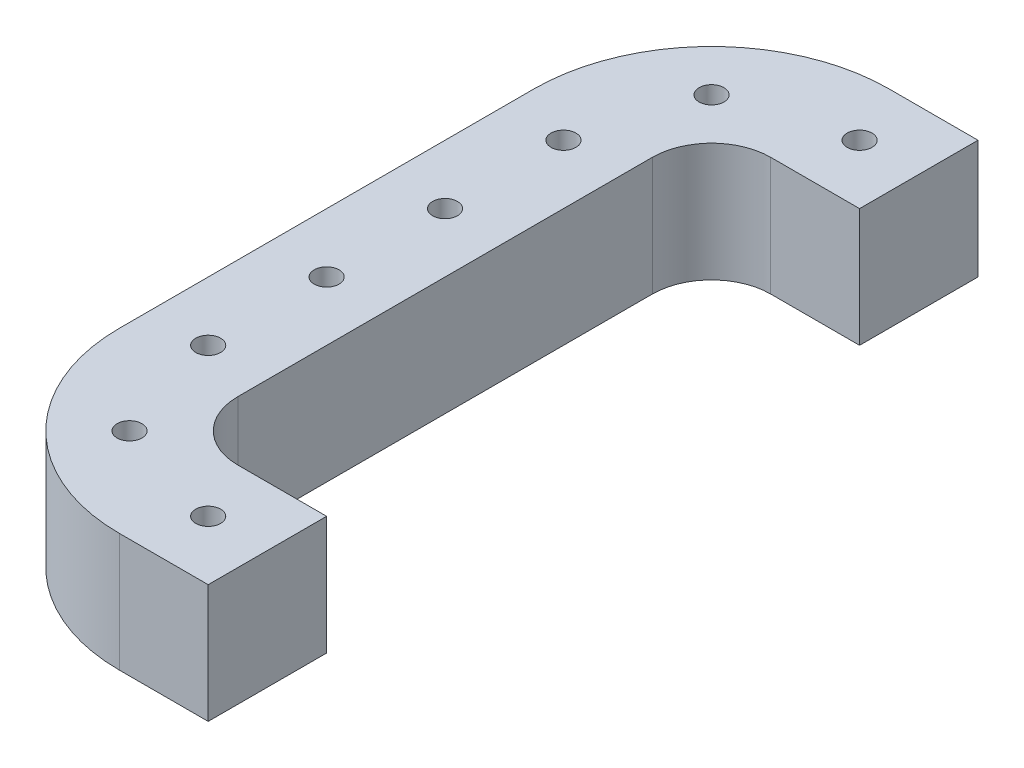
ISO-10303-21;
HEADER;
FILE_DESCRIPTION(('STEP AP214'),'2;1');
FILE_NAME('part.step','',(''),(''),'','','');
FILE_SCHEMA(('AUTOMOTIVE_DESIGN { 1 0 10303 214 1 1 1 1 }'));
ENDSEC;
DATA;
#1=APPLICATION_CONTEXT('core data for automotive mechanical design processes');
#2=APPLICATION_PROTOCOL_DEFINITION('international standard','automotive_design',2000,#1);
#3=PRODUCT_CONTEXT('',#1,'mechanical');
#4=PRODUCT('Part','Part','',(#3));
#5=PRODUCT_RELATED_PRODUCT_CATEGORY('part','',(#4));
#6=PRODUCT_DEFINITION_FORMATION('','',#4);
#7=PRODUCT_DEFINITION_CONTEXT('part definition',#1,'design');
#8=PRODUCT_DEFINITION('design','',#6,#7);
#9=PRODUCT_DEFINITION_SHAPE('','',#8);
#10=(LENGTH_UNIT() NAMED_UNIT(*) SI_UNIT(.MILLI.,.METRE.));
#11=(NAMED_UNIT(*) PLANE_ANGLE_UNIT() SI_UNIT($,.RADIAN.));
#12=(NAMED_UNIT(*) SI_UNIT($,.STERADIAN.) SOLID_ANGLE_UNIT());
#13=UNCERTAINTY_MEASURE_WITH_UNIT(LENGTH_MEASURE(1.E-05),#10,'distance_accuracy_value','');
#14=(GEOMETRIC_REPRESENTATION_CONTEXT(3) GLOBAL_UNCERTAINTY_ASSIGNED_CONTEXT((#13)) GLOBAL_UNIT_ASSIGNED_CONTEXT((#10,
#11,#12)) REPRESENTATION_CONTEXT('',''));
#15=CARTESIAN_POINT('',(0.,0.,0.));
#16=DIRECTION('',(0.,0.,1.));
#17=DIRECTION('',(1.,0.,0.));
#18=AXIS2_PLACEMENT_3D('',#15,#16,#17);
#19=CARTESIAN_POINT('',(10.,10.,0.));
#20=DIRECTION('',(-1.,0.,0.));
#21=DIRECTION('',(0.,0.,1.));
#22=AXIS2_PLACEMENT_3D('',#19,#20,#21);
#23=PLANE('',#22);
#24=DIRECTION('',(0.,0.,-1.));
#25=VECTOR('',#24,1.);
#26=CARTESIAN_POINT('',(10.,-10.,0.));
#27=LINE('',#26,#25);
#28=CARTESIAN_POINT('',(10.,-10.,55.));
#29=VERTEX_POINT('',#28);
#30=CARTESIAN_POINT('',(10.,-10.,-15.));
#31=VERTEX_POINT('',#30);
#32=EDGE_CURVE('E125',#29,#31,#27,.T.);
#33=ORIENTED_EDGE('',*,*,#32,.T.);
#34=DIRECTION('',(0.,-1.,0.));
#35=VECTOR('',#34,1.);
#36=CARTESIAN_POINT('',(10.,10.,-15.));
#37=LINE('',#36,#35);
#38=CARTESIAN_POINT('',(10.,10.,-15.));
#39=VERTEX_POINT('',#38);
#40=EDGE_CURVE('E11',#39,#31,#37,.T.);
#41=ORIENTED_EDGE('',*,*,#40,.F.);
#42=DIRECTION('',(0.,0.,-1.));
#43=VECTOR('',#42,1.);
#44=CARTESIAN_POINT('',(10.,10.,0.));
#45=LINE('',#44,#43);
#46=CARTESIAN_POINT('',(10.,10.,55.));
#47=VERTEX_POINT('',#46);
#48=EDGE_CURVE('E87',#47,#39,#45,.T.);
#49=ORIENTED_EDGE('',*,*,#48,.F.);
#50=DIRECTION('',(0.,-1.,0.));
#51=VECTOR('',#50,1.);
#52=CARTESIAN_POINT('',(10.,10.,55.));
#53=LINE('',#52,#51);
#54=EDGE_CURVE('E189',#47,#29,#53,.T.);
#55=ORIENTED_EDGE('',*,*,#54,.T.);
#56=EDGE_LOOP('',(#33,#41,#49,#55));
#57=FACE_BOUND('',#56,.T.);
#58=ADVANCED_FACE('F33',(#57),#23,.F.);
#59=CARTESIAN_POINT('',(20.,10.,-15.));
#60=DIRECTION('',(0.,-1.,0.));
#61=DIRECTION('',(0.,0.,-1.));
#62=AXIS2_PLACEMENT_3D('',#59,#60,#61);
#63=CYLINDRICAL_SURFACE('',#62,10.);
#64=CARTESIAN_POINT('',(20.,-10.,-15.));
#65=DIRECTION('',(0.,-1.,0.));
#66=DIRECTION('',(0.,0.,-1.));
#67=AXIS2_PLACEMENT_3D('',#64,#65,#66);
#68=CIRCLE('',#67,10.);
#69=CARTESIAN_POINT('',(20.,-10.,-25.));
#70=VERTEX_POINT('',#69);
#71=EDGE_CURVE('E127',#31,#70,#68,.T.);
#72=ORIENTED_EDGE('',*,*,#71,.T.);
#73=DIRECTION('',(0.,-1.,0.));
#74=VECTOR('',#73,1.);
#75=CARTESIAN_POINT('',(20.,10.,-25.));
#76=LINE('',#75,#74);
#77=CARTESIAN_POINT('',(20.,10.,-25.));
#78=VERTEX_POINT('',#77);
#79=EDGE_CURVE('E41',#78,#70,#76,.T.);
#80=ORIENTED_EDGE('',*,*,#79,.F.);
#81=CARTESIAN_POINT('',(20.,10.,-15.));
#82=DIRECTION('',(0.,-1.,0.));
#83=DIRECTION('',(0.,0.,-1.));
#84=AXIS2_PLACEMENT_3D('',#81,#82,#83);
#85=CIRCLE('',#84,10.);
#86=EDGE_CURVE('E216',#39,#78,#85,.T.);
#87=ORIENTED_EDGE('',*,*,#86,.F.);
#88=ORIENTED_EDGE('',*,*,#40,.T.);
#89=EDGE_LOOP('',(#72,#80,#87,#88));
#90=FACE_BOUND('',#89,.T.);
#91=ADVANCED_FACE('F217',(#90),#63,.F.);
#92=CARTESIAN_POINT('',(20.,10.,-25.));
#93=DIRECTION('',(0.,0.,-1.));
#94=DIRECTION('',(-1.,0.,0.));
#95=AXIS2_PLACEMENT_3D('',#92,#93,#94);
#96=PLANE('',#95);
#97=DIRECTION('',(1.,0.,0.));
#98=VECTOR('',#97,1.);
#99=CARTESIAN_POINT('',(20.,-10.,-25.));
#100=LINE('',#99,#98);
#101=CARTESIAN_POINT('',(35.,-10.,-25.));
#102=VERTEX_POINT('',#101);
#103=EDGE_CURVE('E130',#70,#102,#100,.T.);
#104=ORIENTED_EDGE('',*,*,#103,.T.);
#105=DIRECTION('',(0.,-1.,0.));
#106=VECTOR('',#105,1.);
#107=CARTESIAN_POINT('',(35.,10.,-25.));
#108=LINE('',#107,#106);
#109=CARTESIAN_POINT('',(35.,10.,-25.));
#110=VERTEX_POINT('',#109);
#111=EDGE_CURVE('E114',#110,#102,#108,.T.);
#112=ORIENTED_EDGE('',*,*,#111,.F.);
#113=DIRECTION('',(1.,0.,0.));
#114=VECTOR('',#113,1.);
#115=CARTESIAN_POINT('',(20.,10.,-25.));
#116=LINE('',#115,#114);
#117=EDGE_CURVE('E105',#78,#110,#116,.T.);
#118=ORIENTED_EDGE('',*,*,#117,.F.);
#119=ORIENTED_EDGE('',*,*,#79,.T.);
#120=EDGE_LOOP('',(#104,#112,#118,#119));
#121=FACE_BOUND('',#120,.T.);
#122=ADVANCED_FACE('F144',(#121),#96,.F.);
#123=CARTESIAN_POINT('',(35.,10.,-25.));
#124=DIRECTION('',(-1.,0.,0.));
#125=DIRECTION('',(0.,0.,1.));
#126=AXIS2_PLACEMENT_3D('',#123,#124,#125);
#127=PLANE('',#126);
#128=DIRECTION('',(0.,0.,-1.));
#129=VECTOR('',#128,1.);
#130=CARTESIAN_POINT('',(35.,-10.,-25.));
#131=LINE('',#130,#129);
#132=CARTESIAN_POINT('',(35.,-10.,-45.));
#133=VERTEX_POINT('',#132);
#134=EDGE_CURVE('E113',#102,#133,#131,.T.);
#135=ORIENTED_EDGE('',*,*,#134,.T.);
#136=DIRECTION('',(0.,-1.,0.));
#137=VECTOR('',#136,1.);
#138=CARTESIAN_POINT('',(35.,10.,-45.));
#139=LINE('',#138,#137);
#140=CARTESIAN_POINT('',(35.,10.,-45.));
#141=VERTEX_POINT('',#140);
#142=EDGE_CURVE('E110',#141,#133,#139,.T.);
#143=ORIENTED_EDGE('',*,*,#142,.F.);
#144=DIRECTION('',(0.,0.,-1.));
#145=VECTOR('',#144,1.);
#146=CARTESIAN_POINT('',(35.,10.,-25.));
#147=LINE('',#146,#145);
#148=EDGE_CURVE('E98',#110,#141,#147,.T.);
#149=ORIENTED_EDGE('',*,*,#148,.F.);
#150=ORIENTED_EDGE('',*,*,#111,.T.);
#151=EDGE_LOOP('',(#135,#143,#149,#150));
#152=FACE_BOUND('',#151,.T.);
#153=ADVANCED_FACE('F111',(#152),#127,.F.);
#154=CARTESIAN_POINT('',(20.,10.,-45.));
#155=DIRECTION('',(0.,0.,1.));
#156=DIRECTION('',(1.,0.,0.));
#157=AXIS2_PLACEMENT_3D('',#154,#155,#156);
#158=PLANE('',#157);
#159=DIRECTION('',(-1.,0.,0.));
#160=VECTOR('',#159,1.);
#161=CARTESIAN_POINT('',(20.,-10.,-45.));
#162=LINE('',#161,#160);
#163=CARTESIAN_POINT('',(20.,-10.,-45.));
#164=VERTEX_POINT('',#163);
#165=EDGE_CURVE('E73',#133,#164,#162,.T.);
#166=ORIENTED_EDGE('',*,*,#165,.T.);
#167=DIRECTION('',(0.,-1.,0.));
#168=VECTOR('',#167,1.);
#169=CARTESIAN_POINT('',(20.,10.,-45.));
#170=LINE('',#169,#168);
#171=CARTESIAN_POINT('',(20.,10.,-45.));
#172=VERTEX_POINT('',#171);
#173=EDGE_CURVE('E115',#172,#164,#170,.T.);
#174=ORIENTED_EDGE('',*,*,#173,.F.);
#175=DIRECTION('',(-1.,0.,0.));
#176=VECTOR('',#175,1.);
#177=CARTESIAN_POINT('',(20.,10.,-45.));
#178=LINE('',#177,#176);
#179=EDGE_CURVE('E103',#141,#172,#178,.T.);
#180=ORIENTED_EDGE('',*,*,#179,.F.);
#181=ORIENTED_EDGE('',*,*,#142,.T.);
#182=EDGE_LOOP('',(#166,#174,#180,#181));
#183=FACE_BOUND('',#182,.T.);
#184=ADVANCED_FACE('F117',(#183),#158,.F.);
#185=CARTESIAN_POINT('',(20.,10.,-15.));
#186=DIRECTION('',(0.,-1.,0.));
#187=DIRECTION('',(0.,0.,-1.));
#188=AXIS2_PLACEMENT_3D('',#185,#186,#187);
#189=CYLINDRICAL_SURFACE('',#188,30.);
#190=CARTESIAN_POINT('',(20.,-10.,-15.));
#191=DIRECTION('',(0.,1.,0.));
#192=DIRECTION('',(0.,0.,-1.));
#193=AXIS2_PLACEMENT_3D('',#190,#191,#192);
#194=CIRCLE('',#193,30.);
#195=CARTESIAN_POINT('',(-10.,-10.,-15.));
#196=VERTEX_POINT('',#195);
#197=EDGE_CURVE('E79',#164,#196,#194,.T.);
#198=ORIENTED_EDGE('',*,*,#197,.T.);
#199=DIRECTION('',(0.,-1.,0.));
#200=VECTOR('',#199,1.);
#201=CARTESIAN_POINT('',(-10.,10.,-15.));
#202=LINE('',#201,#200);
#203=CARTESIAN_POINT('',(-10.,10.,-15.));
#204=VERTEX_POINT('',#203);
#205=EDGE_CURVE('E124',#204,#196,#202,.T.);
#206=ORIENTED_EDGE('',*,*,#205,.F.);
#207=CARTESIAN_POINT('',(20.,10.,-15.));
#208=DIRECTION('',(0.,1.,0.));
#209=DIRECTION('',(0.,0.,-1.));
#210=AXIS2_PLACEMENT_3D('',#207,#208,#209);
#211=CIRCLE('',#210,30.);
#212=EDGE_CURVE('E49',#172,#204,#211,.T.);
#213=ORIENTED_EDGE('',*,*,#212,.F.);
#214=ORIENTED_EDGE('',*,*,#173,.T.);
#215=EDGE_LOOP('',(#198,#206,#213,#214));
#216=FACE_BOUND('',#215,.T.);
#217=ADVANCED_FACE('F304',(#216),#189,.T.);
#218=CARTESIAN_POINT('',(-10.,10.,0.));
#219=DIRECTION('',(1.,0.,0.));
#220=DIRECTION('',(0.,0.,-1.));
#221=AXIS2_PLACEMENT_3D('',#218,#219,#220);
#222=PLANE('',#221);
#223=DIRECTION('',(0.,0.,1.));
#224=VECTOR('',#223,1.);
#225=CARTESIAN_POINT('',(-10.,-10.,0.));
#226=LINE('',#225,#224);
#227=CARTESIAN_POINT('',(-10.,-10.,55.));
#228=VERTEX_POINT('',#227);
#229=EDGE_CURVE('E135',#196,#228,#226,.T.);
#230=ORIENTED_EDGE('',*,*,#229,.T.);
#231=DIRECTION('',(0.,-1.,0.));
#232=VECTOR('',#231,1.);
#233=CARTESIAN_POINT('',(-10.,10.,55.));
#234=LINE('',#233,#232);
#235=CARTESIAN_POINT('',(-10.,10.,55.));
#236=VERTEX_POINT('',#235);
#237=EDGE_CURVE('E162',#236,#228,#234,.T.);
#238=ORIENTED_EDGE('',*,*,#237,.F.);
#239=DIRECTION('',(0.,0.,1.));
#240=VECTOR('',#239,1.);
#241=CARTESIAN_POINT('',(-10.,10.,0.));
#242=LINE('',#241,#240);
#243=EDGE_CURVE('E119',#204,#236,#242,.T.);
#244=ORIENTED_EDGE('',*,*,#243,.F.);
#245=ORIENTED_EDGE('',*,*,#205,.T.);
#246=EDGE_LOOP('',(#230,#238,#244,#245));
#247=FACE_BOUND('',#246,.T.);
#248=ADVANCED_FACE('F160',(#247),#222,.F.);
#249=CARTESIAN_POINT('',(20.,10.,-15.));
#250=DIRECTION('',(0.,-1.,0.));
#251=DIRECTION('',(0.,0.,-1.));
#252=AXIS2_PLACEMENT_3D('',#249,#250,#251);
#253=PLANE('',#252);
#254=CARTESIAN_POINT('',(0.,10.,10.));
#255=DIRECTION('',(0.,1.,0.));
#256=DIRECTION('',(0.,0.,1.));
#257=AXIS2_PLACEMENT_3D('',#254,#255,#256);
#258=CIRCLE('',#257,2.1);
#259=CARTESIAN_POINT('',(0.,10.,12.1));
#260=VERTEX_POINT('',#259);
#261=EDGE_CURVE('E192',#260,#260,#258,.T.);
#262=ORIENTED_EDGE('',*,*,#261,.F.);
#263=EDGE_LOOP('',(#262));
#264=FACE_BOUND('',#263,.T.);
#265=CARTESIAN_POINT('',(25.,10.,-35.));
#266=DIRECTION('',(0.,1.,0.));
#267=DIRECTION('',(0.,0.,-1.));
#268=AXIS2_PLACEMENT_3D('',#265,#266,#267);
#269=CIRCLE('',#268,2.1);
#270=CARTESIAN_POINT('',(25.,10.,-37.1));
#271=VERTEX_POINT('',#270);
#272=EDGE_CURVE('E203',#271,#271,#269,.T.);
#273=ORIENTED_EDGE('',*,*,#272,.F.);
#274=EDGE_LOOP('',(#273));
#275=FACE_BOUND('',#274,.T.);
#276=CARTESIAN_POINT('',(0.,10.,-10.));
#277=DIRECTION('',(0.,1.,0.));
#278=DIRECTION('',(0.,0.,1.));
#279=AXIS2_PLACEMENT_3D('',#276,#277,#278);
#280=CIRCLE('',#279,2.1);
#281=CARTESIAN_POINT('',(0.,10.,-7.9));
#282=VERTEX_POINT('',#281);
#283=EDGE_CURVE('E197',#282,#282,#280,.T.);
#284=ORIENTED_EDGE('',*,*,#283,.F.);
#285=EDGE_LOOP('',(#284));
#286=FACE_BOUND('',#285,.T.);
#287=CARTESIAN_POINT('',(5.85786437626905,10.,-29.142135623731));
#288=DIRECTION('',(0.,1.,0.));
#289=DIRECTION('',(0.,0.,1.));
#290=AXIS2_PLACEMENT_3D('',#287,#288,#289);
#291=CIRCLE('',#290,2.1);
#292=CARTESIAN_POINT('',(5.85786437626905,10.,-27.042135623731));
#293=VERTEX_POINT('',#292);
#294=EDGE_CURVE('E196',#293,#293,#291,.T.);
#295=ORIENTED_EDGE('',*,*,#294,.F.);
#296=EDGE_LOOP('',(#295));
#297=FACE_BOUND('',#296,.T.);
#298=ORIENTED_EDGE('',*,*,#243,.T.);
#299=CARTESIAN_POINT('',(20.,10.,55.));
#300=DIRECTION('',(0.,-1.,0.));
#301=DIRECTION('',(0.,0.,1.));
#302=AXIS2_PLACEMENT_3D('',#299,#300,#301);
#303=CIRCLE('',#302,30.);
#304=CARTESIAN_POINT('',(20.,10.,85.));
#305=VERTEX_POINT('',#304);
#306=EDGE_CURVE('E171',#305,#236,#303,.T.);
#307=ORIENTED_EDGE('',*,*,#306,.F.);
#308=DIRECTION('',(-1.,0.,0.));
#309=VECTOR('',#308,1.);
#310=CARTESIAN_POINT('',(20.,10.,85.));
#311=LINE('',#310,#309);
#312=CARTESIAN_POINT('',(35.,10.,85.));
#313=VERTEX_POINT('',#312);
#314=EDGE_CURVE('E176',#313,#305,#311,.T.);
#315=ORIENTED_EDGE('',*,*,#314,.F.);
#316=DIRECTION('',(0.,0.,1.));
#317=VECTOR('',#316,1.);
#318=CARTESIAN_POINT('',(35.,10.,65.));
#319=LINE('',#318,#317);
#320=CARTESIAN_POINT('',(35.,10.,65.));
#321=VERTEX_POINT('',#320);
#322=EDGE_CURVE('E249',#321,#313,#319,.T.);
#323=ORIENTED_EDGE('',*,*,#322,.F.);
#324=DIRECTION('',(1.,0.,0.));
#325=VECTOR('',#324,1.);
#326=CARTESIAN_POINT('',(20.,10.,65.));
#327=LINE('',#326,#325);
#328=CARTESIAN_POINT('',(20.,10.,65.));
#329=VERTEX_POINT('',#328);
#330=EDGE_CURVE('E245',#329,#321,#327,.T.);
#331=ORIENTED_EDGE('',*,*,#330,.F.);
#332=CARTESIAN_POINT('',(20.,10.,55.));
#333=DIRECTION('',(0.,1.,0.));
#334=DIRECTION('',(0.,0.,1.));
#335=AXIS2_PLACEMENT_3D('',#332,#333,#334);
#336=CIRCLE('',#335,10.);
#337=EDGE_CURVE('E244',#47,#329,#336,.T.);
#338=ORIENTED_EDGE('',*,*,#337,.F.);
#339=ORIENTED_EDGE('',*,*,#48,.T.);
#340=ORIENTED_EDGE('',*,*,#86,.T.);
#341=ORIENTED_EDGE('',*,*,#117,.T.);
#342=ORIENTED_EDGE('',*,*,#148,.T.);
#343=ORIENTED_EDGE('',*,*,#179,.T.);
#344=ORIENTED_EDGE('',*,*,#212,.T.);
#345=EDGE_LOOP('',(#298,#307,#315,#323,#331,#338,#339,#340,#341,#342,#343,#344));
#346=FACE_BOUND('',#345,.T.);
#347=CARTESIAN_POINT('',(0.,10.,30.));
#348=DIRECTION('',(0.,-1.,0.));
#349=DIRECTION('',(0.,0.,-1.));
#350=AXIS2_PLACEMENT_3D('',#347,#348,#349);
#351=CIRCLE('',#350,2.1);
#352=CARTESIAN_POINT('',(0.,10.,27.9));
#353=VERTEX_POINT('',#352);
#354=EDGE_CURVE('E439',#353,#353,#351,.T.);
#355=ORIENTED_EDGE('',*,*,#354,.T.);
#356=EDGE_LOOP('',(#355));
#357=FACE_BOUND('',#356,.T.);
#358=CARTESIAN_POINT('',(25.,10.,75.));
#359=DIRECTION('',(0.,-1.,0.));
#360=DIRECTION('',(0.,0.,1.));
#361=AXIS2_PLACEMENT_3D('',#358,#359,#360);
#362=CIRCLE('',#361,2.1);
#363=CARTESIAN_POINT('',(25.,10.,77.1));
#364=VERTEX_POINT('',#363);
#365=EDGE_CURVE('E441',#364,#364,#362,.T.);
#366=ORIENTED_EDGE('',*,*,#365,.T.);
#367=EDGE_LOOP('',(#366));
#368=FACE_BOUND('',#367,.T.);
#369=CARTESIAN_POINT('',(0.,10.,50.));
#370=DIRECTION('',(0.,-1.,0.));
#371=DIRECTION('',(0.,0.,-1.));
#372=AXIS2_PLACEMENT_3D('',#369,#370,#371);
#373=CIRCLE('',#372,2.1);
#374=CARTESIAN_POINT('',(0.,10.,47.9));
#375=VERTEX_POINT('',#374);
#376=EDGE_CURVE('E449',#375,#375,#373,.T.);
#377=ORIENTED_EDGE('',*,*,#376,.T.);
#378=EDGE_LOOP('',(#377));
#379=FACE_BOUND('',#378,.T.);
#380=CARTESIAN_POINT('',(5.85786437626905,10.,69.142135623731));
#381=DIRECTION('',(0.,-1.,0.));
#382=DIRECTION('',(0.,0.,-1.));
#383=AXIS2_PLACEMENT_3D('',#380,#381,#382);
#384=CIRCLE('',#383,2.1);
#385=CARTESIAN_POINT('',(5.85786437626905,10.,67.042135623731));
#386=VERTEX_POINT('',#385);
#387=EDGE_CURVE('E237',#386,#386,#384,.T.);
#388=ORIENTED_EDGE('',*,*,#387,.T.);
#389=EDGE_LOOP('',(#388));
#390=FACE_BOUND('',#389,.T.);
#391=ADVANCED_FACE('F100',(#264,#275,#286,#297,#346,#357,#368,#379,#390),#253,.F.);
#392=CARTESIAN_POINT('',(20.,-10.,-15.));
#393=DIRECTION('',(0.,-1.,0.));
#394=DIRECTION('',(0.,0.,-1.));
#395=AXIS2_PLACEMENT_3D('',#392,#393,#394);
#396=PLANE('',#395);
#397=CARTESIAN_POINT('',(0.,-10.,10.));
#398=DIRECTION('',(0.,1.,0.));
#399=DIRECTION('',(0.,0.,1.));
#400=AXIS2_PLACEMENT_3D('',#397,#398,#399);
#401=CIRCLE('',#400,2.1);
#402=CARTESIAN_POINT('',(0.,-10.,12.1));
#403=VERTEX_POINT('',#402);
#404=EDGE_CURVE('E206',#403,#403,#401,.T.);
#405=ORIENTED_EDGE('',*,*,#404,.T.);
#406=EDGE_LOOP('',(#405));
#407=FACE_BOUND('',#406,.T.);
#408=CARTESIAN_POINT('',(25.,-10.,-35.));
#409=DIRECTION('',(0.,1.,0.));
#410=DIRECTION('',(0.,0.,-1.));
#411=AXIS2_PLACEMENT_3D('',#408,#409,#410);
#412=CIRCLE('',#411,2.1);
#413=CARTESIAN_POINT('',(25.,-10.,-37.1));
#414=VERTEX_POINT('',#413);
#415=EDGE_CURVE('E200',#414,#414,#412,.T.);
#416=ORIENTED_EDGE('',*,*,#415,.T.);
#417=EDGE_LOOP('',(#416));
#418=FACE_BOUND('',#417,.T.);
#419=CARTESIAN_POINT('',(0.,-10.,-10.));
#420=DIRECTION('',(0.,1.,0.));
#421=DIRECTION('',(0.,0.,1.));
#422=AXIS2_PLACEMENT_3D('',#419,#420,#421);
#423=CIRCLE('',#422,2.1);
#424=CARTESIAN_POINT('',(0.,-10.,-7.9));
#425=VERTEX_POINT('',#424);
#426=EDGE_CURVE('E193',#425,#425,#423,.T.);
#427=ORIENTED_EDGE('',*,*,#426,.T.);
#428=EDGE_LOOP('',(#427));
#429=FACE_BOUND('',#428,.T.);
#430=CARTESIAN_POINT('',(5.85786437626905,-10.,-29.142135623731));
#431=DIRECTION('',(0.,1.,0.));
#432=DIRECTION('',(0.,0.,1.));
#433=AXIS2_PLACEMENT_3D('',#430,#431,#432);
#434=CIRCLE('',#433,2.1);
#435=CARTESIAN_POINT('',(5.85786437626905,-10.,-27.042135623731));
#436=VERTEX_POINT('',#435);
#437=EDGE_CURVE('E128',#436,#436,#434,.T.);
#438=ORIENTED_EDGE('',*,*,#437,.T.);
#439=EDGE_LOOP('',(#438));
#440=FACE_BOUND('',#439,.T.);
#441=ORIENTED_EDGE('',*,*,#32,.F.);
#442=CARTESIAN_POINT('',(20.,-10.,55.));
#443=DIRECTION('',(0.,1.,0.));
#444=DIRECTION('',(0.,0.,1.));
#445=AXIS2_PLACEMENT_3D('',#442,#443,#444);
#446=CIRCLE('',#445,10.);
#447=CARTESIAN_POINT('',(20.,-10.,65.));
#448=VERTEX_POINT('',#447);
#449=EDGE_CURVE('E225',#29,#448,#446,.T.);
#450=ORIENTED_EDGE('',*,*,#449,.T.);
#451=DIRECTION('',(1.,0.,0.));
#452=VECTOR('',#451,1.);
#453=CARTESIAN_POINT('',(20.,-10.,65.));
#454=LINE('',#453,#452);
#455=CARTESIAN_POINT('',(35.,-10.,65.));
#456=VERTEX_POINT('',#455);
#457=EDGE_CURVE('E231',#448,#456,#454,.T.);
#458=ORIENTED_EDGE('',*,*,#457,.T.);
#459=DIRECTION('',(0.,0.,1.));
#460=VECTOR('',#459,1.);
#461=CARTESIAN_POINT('',(35.,-10.,65.));
#462=LINE('',#461,#460);
#463=CARTESIAN_POINT('',(35.,-10.,85.));
#464=VERTEX_POINT('',#463);
#465=EDGE_CURVE('E234',#456,#464,#462,.T.);
#466=ORIENTED_EDGE('',*,*,#465,.T.);
#467=DIRECTION('',(-1.,0.,0.));
#468=VECTOR('',#467,1.);
#469=CARTESIAN_POINT('',(20.,-10.,85.));
#470=LINE('',#469,#468);
#471=CARTESIAN_POINT('',(20.,-10.,85.));
#472=VERTEX_POINT('',#471);
#473=EDGE_CURVE('E242',#464,#472,#470,.T.);
#474=ORIENTED_EDGE('',*,*,#473,.T.);
#475=CARTESIAN_POINT('',(20.,-10.,55.));
#476=DIRECTION('',(0.,-1.,0.));
#477=DIRECTION('',(0.,0.,1.));
#478=AXIS2_PLACEMENT_3D('',#475,#476,#477);
#479=CIRCLE('',#478,30.);
#480=EDGE_CURVE('E156',#472,#228,#479,.T.);
#481=ORIENTED_EDGE('',*,*,#480,.T.);
#482=ORIENTED_EDGE('',*,*,#229,.F.);
#483=ORIENTED_EDGE('',*,*,#197,.F.);
#484=ORIENTED_EDGE('',*,*,#165,.F.);
#485=ORIENTED_EDGE('',*,*,#134,.F.);
#486=ORIENTED_EDGE('',*,*,#103,.F.);
#487=ORIENTED_EDGE('',*,*,#71,.F.);
#488=EDGE_LOOP('',(#441,#450,#458,#466,#474,#481,#482,#483,#484,#485,#486,#487));
#489=FACE_BOUND('',#488,.T.);
#490=CARTESIAN_POINT('',(0.,-10.,30.));
#491=DIRECTION('',(0.,-1.,0.));
#492=DIRECTION('',(0.,0.,-1.));
#493=AXIS2_PLACEMENT_3D('',#490,#491,#492);
#494=CIRCLE('',#493,2.1);
#495=CARTESIAN_POINT('',(0.,-10.,27.9));
#496=VERTEX_POINT('',#495);
#497=EDGE_CURVE('E436',#496,#496,#494,.T.);
#498=ORIENTED_EDGE('',*,*,#497,.F.);
#499=EDGE_LOOP('',(#498));
#500=FACE_BOUND('',#499,.T.);
#501=CARTESIAN_POINT('',(25.,-10.,75.));
#502=DIRECTION('',(0.,-1.,0.));
#503=DIRECTION('',(0.,0.,1.));
#504=AXIS2_PLACEMENT_3D('',#501,#502,#503);
#505=CIRCLE('',#504,2.1);
#506=CARTESIAN_POINT('',(25.,-10.,77.1));
#507=VERTEX_POINT('',#506);
#508=EDGE_CURVE('E446',#507,#507,#505,.T.);
#509=ORIENTED_EDGE('',*,*,#508,.F.);
#510=EDGE_LOOP('',(#509));
#511=FACE_BOUND('',#510,.T.);
#512=CARTESIAN_POINT('',(0.,-10.,50.));
#513=DIRECTION('',(0.,-1.,0.));
#514=DIRECTION('',(0.,0.,-1.));
#515=AXIS2_PLACEMENT_3D('',#512,#513,#514);
#516=CIRCLE('',#515,2.1);
#517=CARTESIAN_POINT('',(0.,-10.,47.9));
#518=VERTEX_POINT('',#517);
#519=EDGE_CURVE('E452',#518,#518,#516,.T.);
#520=ORIENTED_EDGE('',*,*,#519,.F.);
#521=EDGE_LOOP('',(#520));
#522=FACE_BOUND('',#521,.T.);
#523=CARTESIAN_POINT('',(5.85786437626905,-10.,69.142135623731));
#524=DIRECTION('',(0.,-1.,0.));
#525=DIRECTION('',(0.,0.,-1.));
#526=AXIS2_PLACEMENT_3D('',#523,#524,#525);
#527=CIRCLE('',#526,2.1);
#528=CARTESIAN_POINT('',(5.85786437626905,-10.,67.042135623731));
#529=VERTEX_POINT('',#528);
#530=EDGE_CURVE('E232',#529,#529,#527,.T.);
#531=ORIENTED_EDGE('',*,*,#530,.F.);
#532=EDGE_LOOP('',(#531));
#533=FACE_BOUND('',#532,.T.);
#534=ADVANCED_FACE('F150',(#407,#418,#429,#440,#489,#500,#511,#522,#533),#396,.T.);
#535=CARTESIAN_POINT('',(5.85786437626905,-10.,-29.142135623731));
#536=DIRECTION('',(0.,1.,0.));
#537=DIRECTION('',(0.,0.,1.));
#538=AXIS2_PLACEMENT_3D('',#535,#536,#537);
#539=CYLINDRICAL_SURFACE('',#538,2.1);
#540=ORIENTED_EDGE('',*,*,#437,.F.);
#541=EDGE_LOOP('',(#540));
#542=FACE_BOUND('',#541,.T.);
#543=ORIENTED_EDGE('',*,*,#294,.T.);
#544=EDGE_LOOP('',(#543));
#545=FACE_BOUND('',#544,.T.);
#546=ADVANCED_FACE('F311',(#542,#545),#539,.F.);
#547=CARTESIAN_POINT('',(0.,-10.,-10.));
#548=DIRECTION('',(0.,1.,0.));
#549=DIRECTION('',(0.,0.,1.));
#550=AXIS2_PLACEMENT_3D('',#547,#548,#549);
#551=CYLINDRICAL_SURFACE('',#550,2.1);
#552=ORIENTED_EDGE('',*,*,#426,.F.);
#553=EDGE_LOOP('',(#552));
#554=FACE_BOUND('',#553,.T.);
#555=ORIENTED_EDGE('',*,*,#283,.T.);
#556=EDGE_LOOP('',(#555));
#557=FACE_BOUND('',#556,.T.);
#558=ADVANCED_FACE('F318',(#554,#557),#551,.F.);
#559=CARTESIAN_POINT('',(25.,-10.,-35.));
#560=DIRECTION('',(0.,1.,0.));
#561=DIRECTION('',(0.,0.,1.));
#562=AXIS2_PLACEMENT_3D('',#559,#560,#561);
#563=CYLINDRICAL_SURFACE('',#562,2.1);
#564=ORIENTED_EDGE('',*,*,#415,.F.);
#565=EDGE_LOOP('',(#564));
#566=FACE_BOUND('',#565,.T.);
#567=ORIENTED_EDGE('',*,*,#272,.T.);
#568=EDGE_LOOP('',(#567));
#569=FACE_BOUND('',#568,.T.);
#570=ADVANCED_FACE('F322',(#566,#569),#563,.F.);
#571=CARTESIAN_POINT('',(0.,-10.,10.));
#572=DIRECTION('',(0.,1.,0.));
#573=DIRECTION('',(0.,0.,1.));
#574=AXIS2_PLACEMENT_3D('',#571,#572,#573);
#575=CYLINDRICAL_SURFACE('',#574,2.1);
#576=ORIENTED_EDGE('',*,*,#404,.F.);
#577=EDGE_LOOP('',(#576));
#578=FACE_BOUND('',#577,.T.);
#579=ORIENTED_EDGE('',*,*,#261,.T.);
#580=EDGE_LOOP('',(#579));
#581=FACE_BOUND('',#580,.T.);
#582=ADVANCED_FACE('F289',(#578,#581),#575,.F.);
#583=CARTESIAN_POINT('',(20.,10.,55.));
#584=DIRECTION('',(0.,-1.,0.));
#585=DIRECTION('',(0.,0.,1.));
#586=AXIS2_PLACEMENT_3D('',#583,#584,#585);
#587=CYLINDRICAL_SURFACE('',#586,10.);
#588=ORIENTED_EDGE('',*,*,#449,.F.);
#589=ORIENTED_EDGE('',*,*,#54,.F.);
#590=ORIENTED_EDGE('',*,*,#337,.T.);
#591=DIRECTION('',(0.,-1.,0.));
#592=VECTOR('',#591,1.);
#593=CARTESIAN_POINT('',(20.,10.,65.));
#594=LINE('',#593,#592);
#595=EDGE_CURVE('E186',#329,#448,#594,.T.);
#596=ORIENTED_EDGE('',*,*,#595,.T.);
#597=EDGE_LOOP('',(#588,#589,#590,#596));
#598=FACE_BOUND('',#597,.T.);
#599=ADVANCED_FACE('F228',(#598),#587,.F.);
#600=CARTESIAN_POINT('',(20.,10.,65.));
#601=DIRECTION('',(0.,0.,1.));
#602=DIRECTION('',(-1.,0.,0.));
#603=AXIS2_PLACEMENT_3D('',#600,#601,#602);
#604=PLANE('',#603);
#605=ORIENTED_EDGE('',*,*,#457,.F.);
#606=ORIENTED_EDGE('',*,*,#595,.F.);
#607=ORIENTED_EDGE('',*,*,#330,.T.);
#608=DIRECTION('',(0.,-1.,0.));
#609=VECTOR('',#608,1.);
#610=CARTESIAN_POINT('',(35.,10.,65.));
#611=LINE('',#610,#609);
#612=EDGE_CURVE('E183',#321,#456,#611,.T.);
#613=ORIENTED_EDGE('',*,*,#612,.T.);
#614=EDGE_LOOP('',(#605,#606,#607,#613));
#615=FACE_BOUND('',#614,.T.);
#616=ADVANCED_FACE('F280',(#615),#604,.F.);
#617=CARTESIAN_POINT('',(35.,10.,65.));
#618=DIRECTION('',(-1.,0.,0.));
#619=DIRECTION('',(0.,0.,-1.));
#620=AXIS2_PLACEMENT_3D('',#617,#618,#619);
#621=PLANE('',#620);
#622=ORIENTED_EDGE('',*,*,#465,.F.);
#623=ORIENTED_EDGE('',*,*,#612,.F.);
#624=ORIENTED_EDGE('',*,*,#322,.T.);
#625=DIRECTION('',(0.,-1.,0.));
#626=VECTOR('',#625,1.);
#627=CARTESIAN_POINT('',(35.,10.,85.));
#628=LINE('',#627,#626);
#629=EDGE_CURVE('E174',#313,#464,#628,.T.);
#630=ORIENTED_EDGE('',*,*,#629,.T.);
#631=EDGE_LOOP('',(#622,#623,#624,#630));
#632=FACE_BOUND('',#631,.T.);
#633=ADVANCED_FACE('F278',(#632),#621,.F.);
#634=CARTESIAN_POINT('',(20.,10.,85.));
#635=DIRECTION('',(0.,0.,-1.));
#636=DIRECTION('',(1.,0.,0.));
#637=AXIS2_PLACEMENT_3D('',#634,#635,#636);
#638=PLANE('',#637);
#639=ORIENTED_EDGE('',*,*,#473,.F.);
#640=ORIENTED_EDGE('',*,*,#629,.F.);
#641=ORIENTED_EDGE('',*,*,#314,.T.);
#642=DIRECTION('',(0.,-1.,0.));
#643=VECTOR('',#642,1.);
#644=CARTESIAN_POINT('',(20.,10.,85.));
#645=LINE('',#644,#643);
#646=EDGE_CURVE('E172',#305,#472,#645,.T.);
#647=ORIENTED_EDGE('',*,*,#646,.T.);
#648=EDGE_LOOP('',(#639,#640,#641,#647));
#649=FACE_BOUND('',#648,.T.);
#650=ADVANCED_FACE('F259',(#649),#638,.F.);
#651=CARTESIAN_POINT('',(20.,10.,55.));
#652=DIRECTION('',(0.,-1.,0.));
#653=DIRECTION('',(0.,0.,1.));
#654=AXIS2_PLACEMENT_3D('',#651,#652,#653);
#655=CYLINDRICAL_SURFACE('',#654,30.);
#656=ORIENTED_EDGE('',*,*,#480,.F.);
#657=ORIENTED_EDGE('',*,*,#646,.F.);
#658=ORIENTED_EDGE('',*,*,#306,.T.);
#659=ORIENTED_EDGE('',*,*,#237,.T.);
#660=EDGE_LOOP('',(#656,#657,#658,#659));
#661=FACE_BOUND('',#660,.T.);
#662=ADVANCED_FACE('F167',(#661),#655,.T.);
#663=CARTESIAN_POINT('',(5.85786437626905,-10.,69.142135623731));
#664=DIRECTION('',(0.,1.,0.));
#665=DIRECTION('',(0.,0.,-1.));
#666=AXIS2_PLACEMENT_3D('',#663,#664,#665);
#667=CYLINDRICAL_SURFACE('',#666,2.1);
#668=ORIENTED_EDGE('',*,*,#530,.T.);
#669=EDGE_LOOP('',(#668));
#670=FACE_BOUND('',#669,.T.);
#671=ORIENTED_EDGE('',*,*,#387,.F.);
#672=EDGE_LOOP('',(#671));
#673=FACE_BOUND('',#672,.T.);
#674=ADVANCED_FACE('F390',(#670,#673),#667,.F.);
#675=CARTESIAN_POINT('',(0.,-10.,50.));
#676=DIRECTION('',(0.,1.,0.));
#677=DIRECTION('',(0.,0.,-1.));
#678=AXIS2_PLACEMENT_3D('',#675,#676,#677);
#679=CYLINDRICAL_SURFACE('',#678,2.1);
#680=ORIENTED_EDGE('',*,*,#519,.T.);
#681=EDGE_LOOP('',(#680));
#682=FACE_BOUND('',#681,.T.);
#683=ORIENTED_EDGE('',*,*,#376,.F.);
#684=EDGE_LOOP('',(#683));
#685=FACE_BOUND('',#684,.T.);
#686=ADVANCED_FACE('F399',(#682,#685),#679,.F.);
#687=CARTESIAN_POINT('',(25.,-10.,75.));
#688=DIRECTION('',(0.,1.,0.));
#689=DIRECTION('',(0.,0.,-1.));
#690=AXIS2_PLACEMENT_3D('',#687,#688,#689);
#691=CYLINDRICAL_SURFACE('',#690,2.1);
#692=ORIENTED_EDGE('',*,*,#508,.T.);
#693=EDGE_LOOP('',(#692));
#694=FACE_BOUND('',#693,.T.);
#695=ORIENTED_EDGE('',*,*,#365,.F.);
#696=EDGE_LOOP('',(#695));
#697=FACE_BOUND('',#696,.T.);
#698=ADVANCED_FACE('F409',(#694,#697),#691,.F.);
#699=CARTESIAN_POINT('',(0.,-10.,30.));
#700=DIRECTION('',(0.,1.,0.));
#701=DIRECTION('',(0.,0.,-1.));
#702=AXIS2_PLACEMENT_3D('',#699,#700,#701);
#703=CYLINDRICAL_SURFACE('',#702,2.1);
#704=ORIENTED_EDGE('',*,*,#497,.T.);
#705=EDGE_LOOP('',(#704));
#706=FACE_BOUND('',#705,.T.);
#707=ORIENTED_EDGE('',*,*,#354,.F.);
#708=EDGE_LOOP('',(#707));
#709=FACE_BOUND('',#708,.T.);
#710=ADVANCED_FACE('F419',(#706,#709),#703,.F.);
#711=CLOSED_SHELL('',(#58,#91,#122,#153,#184,#217,#248,#391,#534,#546,#558,#570,#582,#599,#616,
#633,#650,#662,#674,#686,#698,#710));
#712=MANIFOLD_SOLID_BREP('B2',#711);
#713=ADVANCED_BREP_SHAPE_REPRESENTATION('',(#18,#712),#14);
#714=SHAPE_DEFINITION_REPRESENTATION(#9,#713);
ENDSEC;
END-ISO-10303-21;
